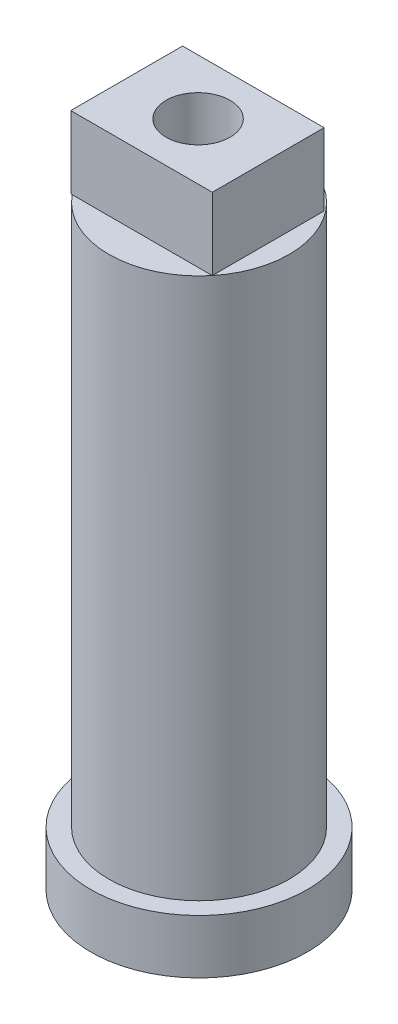
ISO-10303-21;
HEADER;
FILE_DESCRIPTION(('STEP AP214'),'2;1');
FILE_NAME('part.step','',(''),(''),'','','');
FILE_SCHEMA(('AUTOMOTIVE_DESIGN { 1 0 10303 214 1 1 1 1 }'));
ENDSEC;
DATA;
#1=APPLICATION_CONTEXT('core data for automotive mechanical design processes');
#2=APPLICATION_PROTOCOL_DEFINITION('international standard','automotive_design',2000,#1);
#3=PRODUCT_CONTEXT('',#1,'mechanical');
#4=PRODUCT('Part','Part','',(#3));
#5=PRODUCT_RELATED_PRODUCT_CATEGORY('part','',(#4));
#6=PRODUCT_DEFINITION_FORMATION('','',#4);
#7=PRODUCT_DEFINITION_CONTEXT('part definition',#1,'design');
#8=PRODUCT_DEFINITION('design','',#6,#7);
#9=PRODUCT_DEFINITION_SHAPE('','',#8);
#10=(LENGTH_UNIT() NAMED_UNIT(*) SI_UNIT(.MILLI.,.METRE.));
#11=(NAMED_UNIT(*) PLANE_ANGLE_UNIT() SI_UNIT($,.RADIAN.));
#12=(NAMED_UNIT(*) SI_UNIT($,.STERADIAN.) SOLID_ANGLE_UNIT());
#13=UNCERTAINTY_MEASURE_WITH_UNIT(LENGTH_MEASURE(1.E-05),#10,'distance_accuracy_value','');
#14=(GEOMETRIC_REPRESENTATION_CONTEXT(3) GLOBAL_UNCERTAINTY_ASSIGNED_CONTEXT((#13)) GLOBAL_UNIT_ASSIGNED_CONTEXT((#10,
#11,#12)) REPRESENTATION_CONTEXT('',''));
#15=CARTESIAN_POINT('',(0.,0.,0.));
#16=DIRECTION('',(0.,0.,1.));
#17=DIRECTION('',(1.,0.,0.));
#18=AXIS2_PLACEMENT_3D('',#15,#16,#17);
#19=CARTESIAN_POINT('',(-2.37645765475324,30.,-3.69671190739393));
#20=DIRECTION('',(0.,1.,0.));
#21=DIRECTION('',(0.,0.,1.));
#22=AXIS2_PLACEMENT_3D('',#19,#20,#21);
#23=PLANE('',#22);
#24=DIRECTION('',(0.,0.,1.));
#25=VECTOR('',#24,1.);
#26=CARTESIAN_POINT('',(-6.33889015948386,30.,-6.74615917623695));
#27=LINE('',#26,#25);
#28=CARTESIAN_POINT('',(-6.33889015948386,30.,-6.74615917623695));
#29=VERTEX_POINT('',#28);
#30=CARTESIAN_POINT('',(-6.33889015948386,30.,-0.6472646385509));
#31=VERTEX_POINT('',#30);
#32=EDGE_CURVE('E121',#29,#31,#27,.T.);
#33=ORIENTED_EDGE('',*,*,#32,.F.);
#34=CARTESIAN_POINT('',(-2.37645765475324,30.,-3.69671190739393));
#35=DIRECTION('',(0.,1.,0.));
#36=DIRECTION('',(0.,0.,1.));
#37=AXIS2_PLACEMENT_3D('',#34,#35,#36);
#38=CIRCLE('',#37,5.);
#39=EDGE_CURVE('E288',#29,#31,#38,.T.);
#40=ORIENTED_EDGE('',*,*,#39,.T.);
#41=EDGE_LOOP('',(#33,#40));
#42=FACE_BOUND('',#41,.T.);
#43=ADVANCED_FACE('F33',(#42),#23,.T.);
#44=DIRECTION('',(-1.,0.,0.));
#45=VECTOR('',#44,1.);
#46=CARTESIAN_POINT('',(-6.33889015948386,30.,-6.74615917623695));
#47=LINE('',#46,#45);
#48=CARTESIAN_POINT('',(1.50639906989119,30.,-6.74615917623695));
#49=VERTEX_POINT('',#48);
#50=EDGE_CURVE('E50',#49,#29,#47,.T.);
#51=ORIENTED_EDGE('',*,*,#50,.F.);
#52=DIRECTION('',(0.,0.,-1.));
#53=VECTOR('',#52,1.);
#54=CARTESIAN_POINT('',(1.50639906989119,30.,-6.74615917623695));
#55=LINE('',#54,#53);
#56=CARTESIAN_POINT('',(1.50639906989119,30.,-0.546565298760686));
#57=VERTEX_POINT('',#56);
#58=EDGE_CURVE('E119',#57,#49,#55,.T.);
#59=ORIENTED_EDGE('',*,*,#58,.F.);
#60=EDGE_CURVE('E37',#57,#29,#38,.T.);
#61=ORIENTED_EDGE('',*,*,#60,.T.);
#62=EDGE_LOOP('',(#51,#59,#61));
#63=FACE_BOUND('',#62,.T.);
#64=ADVANCED_FACE('F158',(#63),#23,.T.);
#65=CARTESIAN_POINT('',(-2.37645765475324,30.,-3.69671190739393));
#66=DIRECTION('',(0.,-1.,0.));
#67=DIRECTION('',(0.,0.,-1.));
#68=AXIS2_PLACEMENT_3D('',#65,#66,#67);
#69=CYLINDRICAL_SURFACE('',#68,5.);
#70=ORIENTED_EDGE('',*,*,#60,.F.);
#71=CARTESIAN_POINT('',(-6.25931437939767,30.,-0.546565298760686));
#72=VERTEX_POINT('',#71);
#73=EDGE_CURVE('E109',#72,#57,#38,.T.);
#74=ORIENTED_EDGE('',*,*,#73,.F.);
#75=EDGE_CURVE('E110',#31,#72,#38,.T.);
#76=ORIENTED_EDGE('',*,*,#75,.F.);
#77=ORIENTED_EDGE('',*,*,#39,.F.);
#78=EDGE_LOOP('',(#70,#74,#76,#77));
#79=FACE_BOUND('',#78,.T.);
#80=CARTESIAN_POINT('',(-2.37645765475324,0.,-3.69671190739393));
#81=DIRECTION('',(0.,-1.,0.));
#82=DIRECTION('',(0.,0.,-1.));
#83=AXIS2_PLACEMENT_3D('',#80,#81,#82);
#84=CIRCLE('',#83,5.);
#85=CARTESIAN_POINT('',(-2.37645765475324,0.,-8.69671190739393));
#86=VERTEX_POINT('',#85);
#87=EDGE_CURVE('E129',#86,#86,#84,.T.);
#88=ORIENTED_EDGE('',*,*,#87,.F.);
#89=EDGE_LOOP('',(#88));
#90=FACE_BOUND('',#89,.T.);
#91=ADVANCED_FACE('F35',(#79,#90),#69,.T.);
#92=DIRECTION('',(1.,0.,0.));
#93=VECTOR('',#92,1.);
#94=CARTESIAN_POINT('',(-6.33889015948386,30.,-0.546565298760686));
#95=LINE('',#94,#93);
#96=EDGE_CURVE('E11',#72,#57,#95,.T.);
#97=ORIENTED_EDGE('',*,*,#96,.F.);
#98=ORIENTED_EDGE('',*,*,#73,.T.);
#99=EDGE_LOOP('',(#97,#98));
#100=FACE_BOUND('',#99,.T.);
#101=ADVANCED_FACE('F157',(#100),#23,.T.);
#102=CARTESIAN_POINT('',(0.,30.,0.));
#103=DIRECTION('',(0.,1.,0.));
#104=DIRECTION('',(0.,0.,1.));
#105=AXIS2_PLACEMENT_3D('',#102,#103,#104);
#106=PLANE('',#105);
#107=CARTESIAN_POINT('',(-6.33889015948386,30.,-0.546565298760686));
#108=VERTEX_POINT('',#107);
#109=EDGE_CURVE('E107',#31,#108,#27,.T.);
#110=ORIENTED_EDGE('',*,*,#109,.F.);
#111=ORIENTED_EDGE('',*,*,#75,.T.);
#112=EDGE_CURVE('E43',#108,#72,#95,.T.);
#113=ORIENTED_EDGE('',*,*,#112,.F.);
#114=EDGE_LOOP('',(#110,#111,#113));
#115=FACE_BOUND('',#114,.T.);
#116=ADVANCED_FACE('F164',(#115),#106,.F.);
#117=CARTESIAN_POINT('',(-6.33889015948386,34.,-6.74615917623695));
#118=DIRECTION('',(1.,0.,0.));
#119=DIRECTION('',(0.,0.,-1.));
#120=AXIS2_PLACEMENT_3D('',#117,#118,#119);
#121=PLANE('',#120);
#122=ORIENTED_EDGE('',*,*,#32,.T.);
#123=ORIENTED_EDGE('',*,*,#109,.T.);
#124=DIRECTION('',(0.,-1.,0.));
#125=VECTOR('',#124,1.);
#126=CARTESIAN_POINT('',(-6.33889015948386,34.,-0.546565298760686));
#127=LINE('',#126,#125);
#128=CARTESIAN_POINT('',(-6.33889015948386,34.,-0.546565298760686));
#129=VERTEX_POINT('',#128);
#130=EDGE_CURVE('E88',#129,#108,#127,.T.);
#131=ORIENTED_EDGE('',*,*,#130,.F.);
#132=DIRECTION('',(0.,0.,1.));
#133=VECTOR('',#132,1.);
#134=CARTESIAN_POINT('',(-6.33889015948386,34.,-6.74615917623695));
#135=LINE('',#134,#133);
#136=CARTESIAN_POINT('',(-6.33889015948386,34.,-6.74615917623695));
#137=VERTEX_POINT('',#136);
#138=EDGE_CURVE('E94',#137,#129,#135,.T.);
#139=ORIENTED_EDGE('',*,*,#138,.F.);
#140=DIRECTION('',(0.,-1.,0.));
#141=VECTOR('',#140,1.);
#142=CARTESIAN_POINT('',(-6.33889015948386,34.,-6.74615917623695));
#143=LINE('',#142,#141);
#144=EDGE_CURVE('E116',#137,#29,#143,.T.);
#145=ORIENTED_EDGE('',*,*,#144,.T.);
#146=EDGE_LOOP('',(#122,#123,#131,#139,#145));
#147=FACE_BOUND('',#146,.T.);
#148=ADVANCED_FACE('F105',(#147),#121,.F.);
#149=CARTESIAN_POINT('',(-6.33889015948386,34.,-0.546565298760686));
#150=DIRECTION('',(0.,0.,-1.));
#151=DIRECTION('',(-1.,0.,0.));
#152=AXIS2_PLACEMENT_3D('',#149,#150,#151);
#153=PLANE('',#152);
#154=ORIENTED_EDGE('',*,*,#112,.T.);
#155=ORIENTED_EDGE('',*,*,#96,.T.);
#156=DIRECTION('',(0.,-1.,0.));
#157=VECTOR('',#156,1.);
#158=CARTESIAN_POINT('',(1.50639906989119,34.,-0.546565298760686));
#159=LINE('',#158,#157);
#160=CARTESIAN_POINT('',(1.50639906989119,34.,-0.546565298760686));
#161=VERTEX_POINT('',#160);
#162=EDGE_CURVE('E90',#161,#57,#159,.T.);
#163=ORIENTED_EDGE('',*,*,#162,.F.);
#164=DIRECTION('',(1.,0.,0.));
#165=VECTOR('',#164,1.);
#166=CARTESIAN_POINT('',(-6.33889015948386,34.,-0.546565298760686));
#167=LINE('',#166,#165);
#168=EDGE_CURVE('E83',#129,#161,#167,.T.);
#169=ORIENTED_EDGE('',*,*,#168,.F.);
#170=ORIENTED_EDGE('',*,*,#130,.T.);
#171=EDGE_LOOP('',(#154,#155,#163,#169,#170));
#172=FACE_BOUND('',#171,.T.);
#173=ADVANCED_FACE('F86',(#172),#153,.F.);
#174=CARTESIAN_POINT('',(1.50639906989119,34.,-6.74615917623695));
#175=DIRECTION('',(-1.,0.,0.));
#176=DIRECTION('',(0.,0.,1.));
#177=AXIS2_PLACEMENT_3D('',#174,#175,#176);
#178=PLANE('',#177);
#179=ORIENTED_EDGE('',*,*,#58,.T.);
#180=DIRECTION('',(0.,-1.,0.));
#181=VECTOR('',#180,1.);
#182=CARTESIAN_POINT('',(1.50639906989119,34.,-6.74615917623695));
#183=LINE('',#182,#181);
#184=CARTESIAN_POINT('',(1.50639906989119,34.,-6.74615917623695));
#185=VERTEX_POINT('',#184);
#186=EDGE_CURVE('E111',#185,#49,#183,.T.);
#187=ORIENTED_EDGE('',*,*,#186,.F.);
#188=DIRECTION('',(0.,0.,-1.));
#189=VECTOR('',#188,1.);
#190=CARTESIAN_POINT('',(1.50639906989119,34.,-6.74615917623695));
#191=LINE('',#190,#189);
#192=EDGE_CURVE('E93',#161,#185,#191,.T.);
#193=ORIENTED_EDGE('',*,*,#192,.F.);
#194=ORIENTED_EDGE('',*,*,#162,.T.);
#195=EDGE_LOOP('',(#179,#187,#193,#194));
#196=FACE_BOUND('',#195,.T.);
#197=ADVANCED_FACE('F174',(#196),#178,.F.);
#198=CARTESIAN_POINT('',(-6.33889015948386,34.,-6.74615917623695));
#199=DIRECTION('',(0.,0.,1.));
#200=DIRECTION('',(1.,0.,0.));
#201=AXIS2_PLACEMENT_3D('',#198,#199,#200);
#202=PLANE('',#201);
#203=ORIENTED_EDGE('',*,*,#50,.T.);
#204=ORIENTED_EDGE('',*,*,#144,.F.);
#205=DIRECTION('',(-1.,0.,0.));
#206=VECTOR('',#205,1.);
#207=CARTESIAN_POINT('',(-6.33889015948386,34.,-6.74615917623695));
#208=LINE('',#207,#206);
#209=EDGE_CURVE('E99',#185,#137,#208,.T.);
#210=ORIENTED_EDGE('',*,*,#209,.F.);
#211=ORIENTED_EDGE('',*,*,#186,.T.);
#212=EDGE_LOOP('',(#203,#204,#210,#211));
#213=FACE_BOUND('',#212,.T.);
#214=ADVANCED_FACE('F177',(#213),#202,.F.);
#215=CARTESIAN_POINT('',(0.,34.,0.));
#216=DIRECTION('',(0.,1.,0.));
#217=DIRECTION('',(0.,0.,1.));
#218=AXIS2_PLACEMENT_3D('',#215,#216,#217);
#219=PLANE('',#218);
#220=CARTESIAN_POINT('',(-2.41554768224361,34.,-3.68118067348178));
#221=DIRECTION('',(0.,1.,0.));
#222=DIRECTION('',(0.,0.,1.));
#223=AXIS2_PLACEMENT_3D('',#220,#221,#222);
#224=CIRCLE('',#223,1.77469596871893);
#225=CARTESIAN_POINT('',(-2.41554768224361,34.,-1.90648470476284));
#226=VERTEX_POINT('',#225);
#227=EDGE_CURVE('E125',#226,#226,#224,.T.);
#228=ORIENTED_EDGE('',*,*,#227,.F.);
#229=EDGE_LOOP('',(#228));
#230=FACE_BOUND('',#229,.T.);
#231=ORIENTED_EDGE('',*,*,#138,.T.);
#232=ORIENTED_EDGE('',*,*,#168,.T.);
#233=ORIENTED_EDGE('',*,*,#192,.T.);
#234=ORIENTED_EDGE('',*,*,#209,.T.);
#235=EDGE_LOOP('',(#231,#232,#233,#234));
#236=FACE_BOUND('',#235,.T.);
#237=ADVANCED_FACE('F97',(#230,#236),#219,.T.);
#238=CARTESIAN_POINT('',(-2.41554768224361,31.,-3.68118067348178));
#239=DIRECTION('',(0.,1.,0.));
#240=DIRECTION('',(0.,0.,1.));
#241=AXIS2_PLACEMENT_3D('',#238,#239,#240);
#242=CYLINDRICAL_SURFACE('',#241,1.77469596871893);
#243=CARTESIAN_POINT('',(-2.41554768224361,31.,-3.68118067348178));
#244=DIRECTION('',(0.,1.,0.));
#245=DIRECTION('',(0.,0.,1.));
#246=AXIS2_PLACEMENT_3D('',#243,#244,#245);
#247=CIRCLE('',#246,1.77469596871893);
#248=CARTESIAN_POINT('',(-2.41554768224361,31.,-1.90648470476284));
#249=VERTEX_POINT('',#248);
#250=EDGE_CURVE('E128',#249,#249,#247,.T.);
#251=ORIENTED_EDGE('',*,*,#250,.F.);
#252=EDGE_LOOP('',(#251));
#253=FACE_BOUND('',#252,.T.);
#254=ORIENTED_EDGE('',*,*,#227,.T.);
#255=EDGE_LOOP('',(#254));
#256=FACE_BOUND('',#255,.T.);
#257=ADVANCED_FACE('F187',(#253,#256),#242,.F.);
#258=CARTESIAN_POINT('',(-2.41554768224361,31.,-3.68118067348178));
#259=DIRECTION('',(0.,1.,0.));
#260=DIRECTION('',(0.,0.,1.));
#261=AXIS2_PLACEMENT_3D('',#258,#259,#260);
#262=PLANE('',#261);
#263=ORIENTED_EDGE('',*,*,#250,.T.);
#264=EDGE_LOOP('',(#263));
#265=FACE_BOUND('',#264,.T.);
#266=ADVANCED_FACE('F152',(#265),#262,.T.);
#267=CARTESIAN_POINT('',(-2.37645765475324,0.,-3.69671190739393));
#268=DIRECTION('',(0.,-1.,0.));
#269=DIRECTION('',(0.,0.,-1.));
#270=AXIS2_PLACEMENT_3D('',#267,#268,#269);
#271=PLANE('',#270);
#272=CARTESIAN_POINT('',(-2.37645765475324,0.,-3.69671190739393));
#273=DIRECTION('',(0.,-1.,0.));
#274=DIRECTION('',(0.,0.,-1.));
#275=AXIS2_PLACEMENT_3D('',#272,#273,#274);
#276=CIRCLE('',#275,6.);
#277=CARTESIAN_POINT('',(-2.37645765475324,0.,-9.69671190739393));
#278=VERTEX_POINT('',#277);
#279=EDGE_CURVE('E135',#278,#278,#276,.T.);
#280=ORIENTED_EDGE('',*,*,#279,.F.);
#281=EDGE_LOOP('',(#280));
#282=FACE_BOUND('',#281,.T.);
#283=ORIENTED_EDGE('',*,*,#87,.T.);
#284=EDGE_LOOP('',(#283));
#285=FACE_BOUND('',#284,.T.);
#286=ADVANCED_FACE('F146',(#282,#285),#271,.F.);
#287=CARTESIAN_POINT('',(-2.37645765475324,-3.,-3.69671190739393));
#288=DIRECTION('',(0.,1.,0.));
#289=DIRECTION('',(0.,0.,1.));
#290=AXIS2_PLACEMENT_3D('',#287,#288,#289);
#291=CYLINDRICAL_SURFACE('',#290,6.);
#292=CARTESIAN_POINT('',(-2.37645765475324,-3.,-3.69671190739393));
#293=DIRECTION('',(0.,-1.,0.));
#294=DIRECTION('',(0.,0.,-1.));
#295=AXIS2_PLACEMENT_3D('',#292,#293,#294);
#296=CIRCLE('',#295,6.);
#297=CARTESIAN_POINT('',(-2.37645765475324,-3.,-9.69671190739393));
#298=VERTEX_POINT('',#297);
#299=EDGE_CURVE('E134',#298,#298,#296,.T.);
#300=ORIENTED_EDGE('',*,*,#299,.F.);
#301=EDGE_LOOP('',(#300));
#302=FACE_BOUND('',#301,.T.);
#303=ORIENTED_EDGE('',*,*,#279,.T.);
#304=EDGE_LOOP('',(#303));
#305=FACE_BOUND('',#304,.T.);
#306=ADVANCED_FACE('F143',(#302,#305),#291,.T.);
#307=CARTESIAN_POINT('',(-2.37645765475324,-3.,-3.69671190739393));
#308=DIRECTION('',(0.,-1.,0.));
#309=DIRECTION('',(0.,0.,-1.));
#310=AXIS2_PLACEMENT_3D('',#307,#308,#309);
#311=PLANE('',#310);
#312=ORIENTED_EDGE('',*,*,#299,.T.);
#313=EDGE_LOOP('',(#312));
#314=FACE_BOUND('',#313,.T.);
#315=ADVANCED_FACE('F141',(#314),#311,.T.);
#316=CLOSED_SHELL('',(#43,#64,#91,#101,#116,#148,#173,#197,#214,#237,#257,#266,#286,#306,#315));
#317=MANIFOLD_SOLID_BREP('B2',#316);
#318=ADVANCED_BREP_SHAPE_REPRESENTATION('',(#18,#317),#14);
#319=SHAPE_DEFINITION_REPRESENTATION(#9,#318);
ENDSEC;
END-ISO-10303-21;
